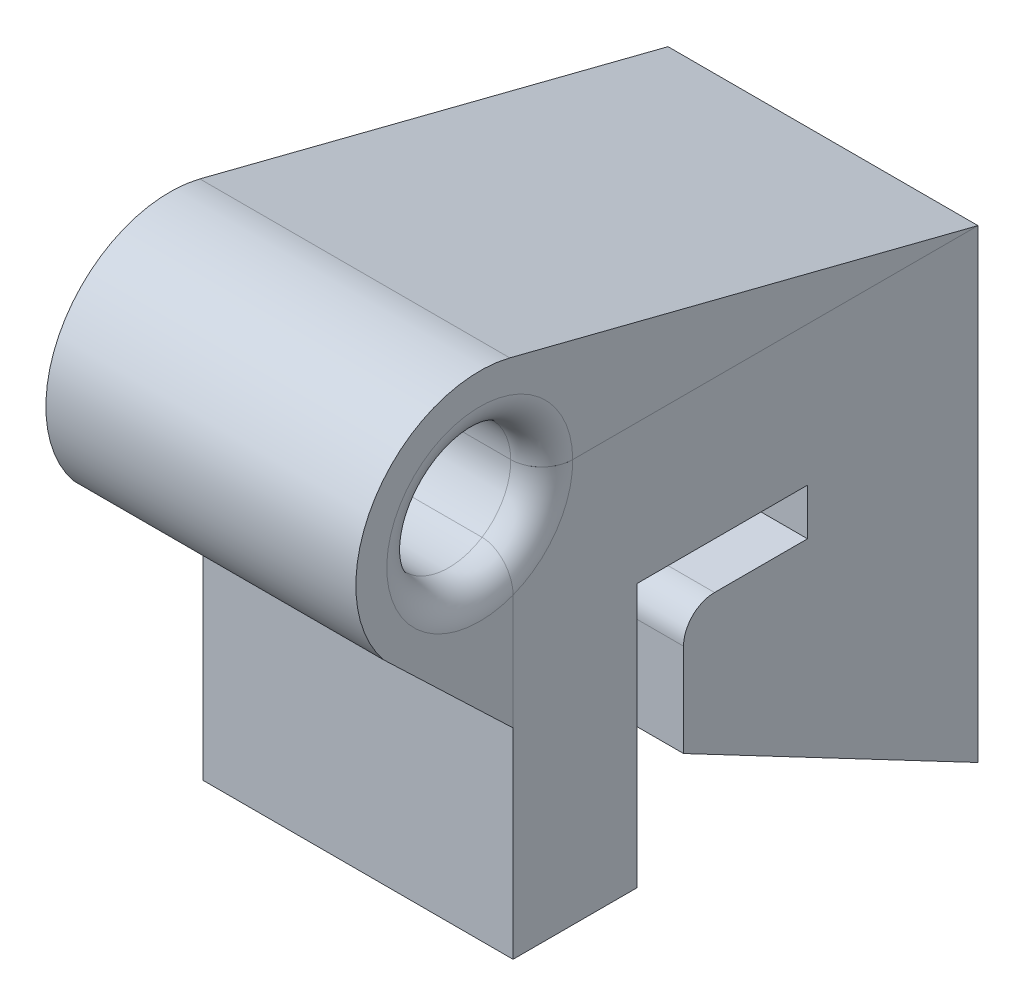
ISO-10303-21;
HEADER;
FILE_DESCRIPTION(('STEP AP214'),'2;1');
FILE_NAME('part.step','',(''),(''),'','','');
FILE_SCHEMA(('AUTOMOTIVE_DESIGN { 1 0 10303 214 1 1 1 1 }'));
ENDSEC;
DATA;
#1=APPLICATION_CONTEXT('core data for automotive mechanical design processes');
#2=APPLICATION_PROTOCOL_DEFINITION('international standard','automotive_design',2000,#1);
#3=PRODUCT_CONTEXT('',#1,'mechanical');
#4=PRODUCT('Part','Part','',(#3));
#5=PRODUCT_RELATED_PRODUCT_CATEGORY('part','',(#4));
#6=PRODUCT_DEFINITION_FORMATION('','',#4);
#7=PRODUCT_DEFINITION_CONTEXT('part definition',#1,'design');
#8=PRODUCT_DEFINITION('design','',#6,#7);
#9=PRODUCT_DEFINITION_SHAPE('','',#8);
#10=(LENGTH_UNIT() NAMED_UNIT(*) SI_UNIT(.MILLI.,.METRE.));
#11=(NAMED_UNIT(*) PLANE_ANGLE_UNIT() SI_UNIT($,.RADIAN.));
#12=(NAMED_UNIT(*) SI_UNIT($,.STERADIAN.) SOLID_ANGLE_UNIT());
#13=UNCERTAINTY_MEASURE_WITH_UNIT(LENGTH_MEASURE(1.E-05),#10,'distance_accuracy_value','');
#14=(GEOMETRIC_REPRESENTATION_CONTEXT(3) GLOBAL_UNCERTAINTY_ASSIGNED_CONTEXT((#13)) GLOBAL_UNIT_ASSIGNED_CONTEXT((#10,
#11,#12)) REPRESENTATION_CONTEXT('',''));
#15=CARTESIAN_POINT('',(0.,0.,0.));
#16=DIRECTION('',(0.,0.,1.));
#17=DIRECTION('',(1.,0.,0.));
#18=AXIS2_PLACEMENT_3D('',#15,#16,#17);
#19=CARTESIAN_POINT('',(10.,9.9788927812813,16.0740086389494));
#20=DIRECTION('',(-1.,0.,0.));
#21=DIRECTION('',(0.,0.,1.));
#22=AXIS2_PLACEMENT_3D('',#19,#20,#21);
#23=CYLINDRICAL_SURFACE('',#22,3.99767477306741);
#24=CARTESIAN_POINT('',(0.,9.9788927812813,16.0740086389494));
#25=DIRECTION('',(-1.,0.,0.));
#26=DIRECTION('',(0.,0.,1.));
#27=AXIS2_PLACEMENT_3D('',#24,#25,#26);
#28=CIRCLE('',#27,3.99767477306741);
#29=CARTESIAN_POINT('',(0.,7.44947043378368,19.1697195717077));
#30=VERTEX_POINT('',#29);
#31=CARTESIAN_POINT('',(0.,13.8572069803928,15.1044300891715));
#32=VERTEX_POINT('',#31);
#33=EDGE_CURVE('E146',#30,#32,#28,.T.);
#34=ORIENTED_EDGE('',*,*,#33,.F.);
#35=DIRECTION('',(-1.,0.,0.));
#36=VECTOR('',#35,1.);
#37=CARTESIAN_POINT('',(10.,7.44947043378368,19.1697195717077));
#38=LINE('',#37,#36);
#39=CARTESIAN_POINT('',(10.,7.44947043378368,19.1697195717077));
#40=VERTEX_POINT('',#39);
#41=EDGE_CURVE('E132',#40,#30,#38,.T.);
#42=ORIENTED_EDGE('',*,*,#41,.F.);
#43=CARTESIAN_POINT('',(10.,9.9788927812813,16.0740086389494));
#44=DIRECTION('',(-1.,0.,0.));
#45=DIRECTION('',(0.,0.,1.));
#46=AXIS2_PLACEMENT_3D('',#43,#44,#45);
#47=CIRCLE('',#46,3.99767477306741);
#48=CARTESIAN_POINT('',(10.,13.8572069803928,15.1044300891715));
#49=VERTEX_POINT('',#48);
#50=EDGE_CURVE('E128',#40,#49,#47,.T.);
#51=ORIENTED_EDGE('',*,*,#50,.T.);
#52=DIRECTION('',(-1.,0.,0.));
#53=VECTOR('',#52,1.);
#54=CARTESIAN_POINT('',(10.,13.8572069803928,15.1044300891715));
#55=LINE('',#54,#53);
#56=EDGE_CURVE('E112',#49,#32,#55,.T.);
#57=ORIENTED_EDGE('',*,*,#56,.T.);
#58=EDGE_LOOP('',(#34,#42,#51,#57));
#59=FACE_BOUND('',#58,.T.);
#60=ADVANCED_FACE('F43',(#59),#23,.T.);
#61=CARTESIAN_POINT('',(10.,7.44947043378368,19.1697195717077));
#62=DIRECTION('',(0.,-0.723120811339232,0.690721573579464));
#63=DIRECTION('',(0.,-0.690721573579464,-0.723120811339232));
#64=AXIS2_PLACEMENT_3D('',#61,#62,#63);
#65=PLANE('',#64);
#66=DIRECTION('',(0.,0.690721573579464,0.723120811339232));
#67=VECTOR('',#66,1.);
#68=CARTESIAN_POINT('',(0.,7.44947043378368,19.1697195717077));
#69=LINE('',#68,#67);
#70=CARTESIAN_POINT('',(0.,3.4665740507837,15.));
#71=VERTEX_POINT('',#70);
#72=EDGE_CURVE('E133',#71,#30,#69,.T.);
#73=ORIENTED_EDGE('',*,*,#72,.F.);
#74=DIRECTION('',(-1.,0.,0.));
#75=VECTOR('',#74,1.);
#76=CARTESIAN_POINT('',(10.,3.4665740507837,15.));
#77=LINE('',#76,#75);
#78=CARTESIAN_POINT('',(10.,3.4665740507837,15.));
#79=VERTEX_POINT('',#78);
#80=EDGE_CURVE('E155',#79,#71,#77,.T.);
#81=ORIENTED_EDGE('',*,*,#80,.F.);
#82=DIRECTION('',(0.,0.690721573579464,0.723120811339232));
#83=VECTOR('',#82,1.);
#84=CARTESIAN_POINT('',(10.,7.44947043378368,19.1697195717077));
#85=LINE('',#84,#83);
#86=EDGE_CURVE('E123',#79,#40,#85,.T.);
#87=ORIENTED_EDGE('',*,*,#86,.T.);
#88=ORIENTED_EDGE('',*,*,#41,.T.);
#89=EDGE_LOOP('',(#73,#81,#87,#88));
#90=FACE_BOUND('',#89,.T.);
#91=ADVANCED_FACE('F200',(#90),#65,.T.);
#92=CARTESIAN_POINT('',(10.,3.4665740507837,15.));
#93=DIRECTION('',(0.,0.,-1.));
#94=DIRECTION('',(-1.,0.,0.));
#95=AXIS2_PLACEMENT_3D('',#92,#93,#94);
#96=PLANE('',#95);
#97=DIRECTION('',(1.,0.,0.));
#98=VECTOR('',#97,1.);
#99=CARTESIAN_POINT('',(0.,8.29173379545276,15.));
#100=LINE('',#99,#98);
#101=CARTESIAN_POINT('',(9.,8.29173379545276,15.));
#102=VERTEX_POINT('',#101);
#103=CARTESIAN_POINT('',(1.,8.29173379545276,15.));
#104=VERTEX_POINT('',#103);
#105=EDGE_CURVE('E139',#102,#104,#100,.F.);
#106=ORIENTED_EDGE('',*,*,#105,.F.);
#107=CARTESIAN_POINT('',(9.,8.29173379545276,15.));
#108=CARTESIAN_POINT('',(9.02544709543695,8.2917373397642,15.));
#109=CARTESIAN_POINT('',(9.05087993396794,8.29058144530707,15.));
#110=CARTESIAN_POINT('',(9.10152589022747,8.28599452617313,15.));
#111=CARTESIAN_POINT('',(9.12673912119642,8.28256475420531,15.));
#112=CARTESIAN_POINT('',(9.20147613416767,8.26898797596519,15.));
#113=CARTESIAN_POINT('',(9.25043615503918,8.25555222936728,15.));
#114=CARTESIAN_POINT('',(9.34529535722023,8.22077683593449,15.));
#115=CARTESIAN_POINT('',(9.39120001043956,8.19945179356844,15.));
#116=CARTESIAN_POINT('',(9.47920726230042,8.14994855881443,15.));
#117=CARTESIAN_POINT('',(9.5213043619609,8.12176066499623,15.));
#118=CARTESIAN_POINT('',(9.60413836786882,8.05715681427401,15.));
#119=CARTESIAN_POINT('',(9.64450353596077,8.02026603030665,15.));
#120=CARTESIAN_POINT('',(9.71939960005461,7.94098928560996,15.));
#121=CARTESIAN_POINT('',(9.75392864524865,7.89860158914974,15.));
#122=CARTESIAN_POINT('',(9.82106092169255,7.8031840859586,15.));
#123=CARTESIAN_POINT('',(9.85272836561246,7.74949409430199,15.));
#124=CARTESIAN_POINT('',(9.90727784774768,7.63782435435628,15.));
#125=CARTESIAN_POINT('',(9.9301586578155,7.57984400773475,15.));
#126=CARTESIAN_POINT('',(9.96535337089247,7.46499711165469,15.));
#127=CARTESIAN_POINT('',(9.97827163769251,7.40831540789738,15.));
#128=CARTESIAN_POINT('',(9.99560330111521,7.29367824872859,15.));
#129=CARTESIAN_POINT('',(10.000017797882,7.23572295906396,15.));
#130=CARTESIAN_POINT('',(10.,7.17773133583372,15.));
#131=B_SPLINE_CURVE_WITH_KNOTS('',3,(#107,#108,#109,#110,#111,#112,#113,#114,#115,#116,#117,
#118,#119,#120,#121,#122,#123,#124,#125,#126,#127,#128,#129,#130),.UNSPECIFIED.,.F.,.F.,(4,2,2,
2,2,2,2,2,2,2,2,4),(0.,0.0762877730423833,0.152533553033116,0.304022916827351,0.455233239164212,
0.606658568597842,0.770075857739805,0.933544874512594,1.11974974761394,1.30598063794629,
1.47975656984723,1.65351001861339),.UNSPECIFIED.);
#132=CARTESIAN_POINT('',(10.,7.17773133583372,15.));
#133=VERTEX_POINT('',#132);
#134=EDGE_CURVE('E70',#102,#133,#131,.T.);
#135=ORIENTED_EDGE('',*,*,#134,.T.);
#136=DIRECTION('',(0.,-1.,0.));
#137=VECTOR('',#136,1.);
#138=CARTESIAN_POINT('',(10.,3.4665740507837,15.));
#139=LINE('',#138,#137);
#140=EDGE_CURVE('E143',#133,#79,#139,.T.);
#141=ORIENTED_EDGE('',*,*,#140,.T.);
#142=ORIENTED_EDGE('',*,*,#80,.T.);
#143=DIRECTION('',(0.,-1.,0.));
#144=VECTOR('',#143,1.);
#145=CARTESIAN_POINT('',(0.,3.4665740507837,15.));
#146=LINE('',#145,#144);
#147=CARTESIAN_POINT('',(0.,7.17773133583372,15.));
#148=VERTEX_POINT('',#147);
#149=EDGE_CURVE('E136',#148,#71,#146,.T.);
#150=ORIENTED_EDGE('',*,*,#149,.F.);
#151=CARTESIAN_POINT('',(0.,7.17773133583372,15.));
#152=CARTESIAN_POINT('',(-3.0125685499296E-05,7.24388369611441,15.));
#153=CARTESIAN_POINT('',(0.00572053511767974,7.309984499745,15.));
#154=CARTESIAN_POINT('',(0.028207000909354,7.44023876160246,15.));
#155=CARTESIAN_POINT('',(0.044933292872155,7.50439385592061,15.));
#156=CARTESIAN_POINT('',(0.0887890039281296,7.62901184815055,15.));
#157=CARTESIAN_POINT('',(0.115914861022887,7.68947600205074,15.));
#158=CARTESIAN_POINT('',(0.179898225159355,7.8050801472146,15.));
#159=CARTESIAN_POINT('',(0.216761707756766,7.86021684077567,15.));
#160=CARTESIAN_POINT('',(0.29958713220885,7.96349425058462,15.));
#161=CARTESIAN_POINT('',(0.345577501387863,8.01161227227202,15.));
#162=CARTESIAN_POINT('',(0.445653493299341,8.09854120549787,15.));
#163=CARTESIAN_POINT('',(0.499728947451445,8.13736365073428,15.));
#164=CARTESIAN_POINT('',(0.601276270595055,8.19570482164855,15.));
#165=CARTESIAN_POINT('',(0.647383281943714,8.21761145380768,15.));
#166=CARTESIAN_POINT('',(0.742567546893551,8.25339992290209,15.));
#167=CARTESIAN_POINT('',(0.791637835410688,8.26729982597099,15.));
#168=CARTESIAN_POINT('',(0.867616436116075,8.28172691957979,15.));
#169=CARTESIAN_POINT('',(0.893946461663748,8.28547018751634,15.));
#170=CARTESIAN_POINT('',(0.946845688375509,8.29047609741769,15.));
#171=CARTESIAN_POINT('',(0.973414932851386,8.29173828071237,15.));
#172=CARTESIAN_POINT('',(1.,8.29173379545276,15.));
#173=B_SPLINE_CURVE_WITH_KNOTS('',3,(#151,#152,#153,#154,#155,#156,#157,#158,#159,#160,#161,
#162,#163,#164,#165,#166,#167,#168,#169,#170,#171,#172),.UNSPECIFIED.,.F.,.F.,(4,2,2,2,2,2,2,2,
2,2,4),(0.,0.198136438131944,0.396101369793226,0.593998556150797,0.792017466636026,
0.990663106316008,1.18906097962663,1.34157754140846,1.4937486077942,1.57342903743854,
1.65312419596224),.UNSPECIFIED.);
#174=EDGE_CURVE('E161',#148,#104,#173,.T.);
#175=ORIENTED_EDGE('',*,*,#174,.T.);
#176=EDGE_LOOP('',(#106,#135,#141,#142,#150,#175));
#177=FACE_BOUND('',#176,.T.);
#178=ADVANCED_FACE('F170',(#177),#96,.T.);
#179=CARTESIAN_POINT('',(10.,10.,15.));
#180=DIRECTION('',(0.,-1.,0.));
#181=DIRECTION('',(0.,0.,-1.));
#182=AXIS2_PLACEMENT_3D('',#179,#180,#181);
#183=PLANE('',#182);
#184=DIRECTION('',(0.,0.,1.));
#185=VECTOR('',#184,1.);
#186=CARTESIAN_POINT('',(10.,10.,15.));
#187=LINE('',#186,#185);
#188=CARTESIAN_POINT('',(10.,10.,0.));
#189=VERTEX_POINT('',#188);
#190=CARTESIAN_POINT('',(10.,10.,13.0740828923154));
#191=VERTEX_POINT('',#190);
#192=EDGE_CURVE('E130',#189,#191,#187,.T.);
#193=ORIENTED_EDGE('',*,*,#192,.T.);
#194=CARTESIAN_POINT('',(10.,10.,13.0740828923154));
#195=CARTESIAN_POINT('',(9.99999981267615,10.,13.1022192326804));
#196=CARTESIAN_POINT('',(9.99881183343086,10.,13.1303420928692));
#197=CARTESIAN_POINT('',(9.99407250941234,10.,13.1863865676825));
#198=CARTESIAN_POINT('',(9.99052127810508,10.,13.2143081919037));
#199=CARTESIAN_POINT('',(9.97635644858273,10.,13.2974224014069));
#200=CARTESIAN_POINT('',(9.96223162115841,10.,13.3520582496375));
#201=CARTESIAN_POINT('',(9.92501038505813,10.,13.458181552626));
#202=CARTESIAN_POINT('',(9.90190967137826,10.,13.5096674828882));
#203=CARTESIAN_POINT('',(9.84739478290441,10.,13.608028819944));
#204=CARTESIAN_POINT('',(9.81598207224556,10.,13.654905036733));
#205=CARTESIAN_POINT('',(9.74573438266287,10.,13.7427163565741));
#206=CARTESIAN_POINT('',(9.70689948168677,10.,13.7836515220111));
#207=CARTESIAN_POINT('',(9.62289906415489,10.,13.8584295646163));
#208=CARTESIAN_POINT('',(9.57773231111771,10.,13.8922710533058));
#209=CARTESIAN_POINT('',(9.48235500208137,10.,13.9518939594177));
#210=CARTESIAN_POINT('',(9.43214359819379,10.,13.9776740188968));
#211=CARTESIAN_POINT('',(9.32811508390314,10.,14.0204246454582));
#212=CARTESIAN_POINT('',(9.2743001093107,10.,14.037400379524));
#213=CARTESIAN_POINT('',(9.18346297902891,10.,14.0578400170123));
#214=CARTESIAN_POINT('',(9.14701243526492,10.,14.0639413253263));
#215=CARTESIAN_POINT('',(9.07371302402608,10.,14.0720807898538));
#216=CARTESIAN_POINT('',(9.03686479579395,10.,14.0741247044418));
#217=CARTESIAN_POINT('',(9.,10.,14.0741200207214));
#218=B_SPLINE_CURVE_WITH_KNOTS('',3,(#194,#195,#196,#197,#198,#199,#200,#201,#202,#203,#204,
#205,#206,#207,#208,#209,#210,#211,#212,#213,#214,#215,#216,#217),.UNSPECIFIED.,.F.,.F.,(4,2,2,
2,2,2,2,2,2,2,2,4),(0.,0.0843571735106671,0.168710297103282,0.337138352430977,0.505647288935414,
0.674126562796607,0.842604067387757,1.01111451814368,1.17965333911844,1.34809313768172,
1.45875581829624,1.56926133052303),.UNSPECIFIED.);
#219=CARTESIAN_POINT('',(9.,10.,14.0741200207214));
#220=VERTEX_POINT('',#219);
#221=EDGE_CURVE('E12',#191,#220,#218,.T.);
#222=ORIENTED_EDGE('',*,*,#221,.T.);
#223=DIRECTION('',(1.,0.,0.));
#224=VECTOR('',#223,1.);
#225=CARTESIAN_POINT('',(0.,10.,14.0741200207214));
#226=LINE('',#225,#224);
#227=CARTESIAN_POINT('',(1.,10.,14.0741200207214));
#228=VERTEX_POINT('',#227);
#229=EDGE_CURVE('E220',#228,#220,#226,.T.);
#230=ORIENTED_EDGE('',*,*,#229,.F.);
#231=CARTESIAN_POINT('',(1.,10.,14.0741200207214));
#232=CARTESIAN_POINT('',(0.971866234881468,10.,14.0741198348651));
#233=CARTESIAN_POINT('',(0.943745948604871,10.,14.0729319465127));
#234=CARTESIAN_POINT('',(0.887706612508961,10.,14.0681929847874));
#235=CARTESIAN_POINT('',(0.859787553070328,10.,14.0646420251449));
#236=CARTESIAN_POINT('',(0.776681112263235,10.,14.0504783023569));
#237=CARTESIAN_POINT('',(0.722050432171713,10.,14.0363546016038));
#238=CARTESIAN_POINT('',(0.615937232287861,10.,13.9991365152918));
#239=CARTESIAN_POINT('',(0.564456235013657,10.,13.9760378303766));
#240=CARTESIAN_POINT('',(0.466104167363311,10.,13.9215280541669));
#241=CARTESIAN_POINT('',(0.419232289702957,10.,13.8901184220988));
#242=CARTESIAN_POINT('',(0.33142725948012,10.,13.8198769560327));
#243=CARTESIAN_POINT('',(0.290494230159394,10.,13.7810449680461));
#244=CARTESIAN_POINT('',(0.215719369888499,10.,13.6970511448349));
#245=CARTESIAN_POINT('',(0.18187892846932,10.,13.6518880721546));
#246=CARTESIAN_POINT('',(0.122254370587293,10.,13.5565152902386));
#247=CARTESIAN_POINT('',(0.0964721948418925,10.,13.5063043691433));
#248=CARTESIAN_POINT('',(0.0537166101945912,10.,13.402276647408));
#249=CARTESIAN_POINT('',(0.0367380437921304,10.,13.3484619788995));
#250=CARTESIAN_POINT('',(0.0162901221563924,10.,13.25761228751));
#251=CARTESIAN_POINT('',(0.010185026658284,10.,13.2211486888876));
#252=CARTESIAN_POINT('',(0.00204050162099302,10.,13.1478227866445));
#253=CARTESIAN_POINT('',(-4.68939928737875E-06,10.,13.1109611227779));
#254=CARTESIAN_POINT('',(0.,10.,13.0740828923154));
#255=B_SPLINE_CURVE_WITH_KNOTS('',3,(#231,#232,#233,#234,#235,#236,#237,#238,#239,#240,#241,
#242,#243,#244,#245,#246,#247,#248,#249,#250,#251,#252,#253,#254),.UNSPECIFIED.,.F.,.F.,(4,2,2,
2,2,2,2,2,2,2,2,4),(0.,0.0843494518869789,0.168694844481585,0.337107111766347,0.505600154547458,
0.674063633123044,0.842530607118182,1.01103055521524,1.17957105288877,1.34801270103404,
1.45871568355569,1.5692614529184),.UNSPECIFIED.);
#256=CARTESIAN_POINT('',(0.,10.,13.0740828923154));
#257=VERTEX_POINT('',#256);
#258=EDGE_CURVE('E181',#228,#257,#255,.T.);
#259=ORIENTED_EDGE('',*,*,#258,.T.);
#260=DIRECTION('',(0.,0.,1.));
#261=VECTOR('',#260,1.);
#262=CARTESIAN_POINT('',(0.,10.,15.));
#263=LINE('',#262,#261);
#264=CARTESIAN_POINT('',(0.,10.,0.));
#265=VERTEX_POINT('',#264);
#266=EDGE_CURVE('E149',#265,#257,#263,.T.);
#267=ORIENTED_EDGE('',*,*,#266,.F.);
#268=DIRECTION('',(-1.,0.,0.));
#269=VECTOR('',#268,1.);
#270=CARTESIAN_POINT('',(10.,10.,0.));
#271=LINE('',#270,#269);
#272=EDGE_CURVE('E122',#189,#265,#271,.T.);
#273=ORIENTED_EDGE('',*,*,#272,.F.);
#274=EDGE_LOOP('',(#193,#222,#230,#259,#267,#273));
#275=FACE_BOUND('',#274,.T.);
#276=ADVANCED_FACE('F188',(#275),#183,.T.);
#277=CARTESIAN_POINT('',(10.,10.,0.));
#278=DIRECTION('',(0.,0.968906074081107,-0.247428817256067));
#279=DIRECTION('',(0.,0.247428817256067,0.968906074081107));
#280=AXIS2_PLACEMENT_3D('',#277,#278,#279);
#281=PLANE('',#280);
#282=DIRECTION('',(0.,-0.247428817256067,-0.968906074081107));
#283=VECTOR('',#282,1.);
#284=CARTESIAN_POINT('',(0.,10.,0.));
#285=LINE('',#284,#283);
#286=EDGE_CURVE('E117',#32,#265,#285,.T.);
#287=ORIENTED_EDGE('',*,*,#286,.F.);
#288=ORIENTED_EDGE('',*,*,#56,.F.);
#289=DIRECTION('',(0.,-0.247428817256067,-0.968906074081107));
#290=VECTOR('',#289,1.);
#291=CARTESIAN_POINT('',(10.,10.,0.));
#292=LINE('',#291,#290);
#293=EDGE_CURVE('E115',#49,#189,#292,.T.);
#294=ORIENTED_EDGE('',*,*,#293,.T.);
#295=ORIENTED_EDGE('',*,*,#272,.T.);
#296=EDGE_LOOP('',(#287,#288,#294,#295));
#297=FACE_BOUND('',#296,.T.);
#298=ADVANCED_FACE('F114',(#297),#281,.T.);
#299=CARTESIAN_POINT('',(10.,9.9788927812813,16.0740086389494));
#300=DIRECTION('',(-1.,0.,0.));
#301=DIRECTION('',(0.,0.,1.));
#302=AXIS2_PLACEMENT_3D('',#299,#300,#301);
#303=PLANE('',#302);
#304=ORIENTED_EDGE('',*,*,#140,.F.);
#305=CARTESIAN_POINT('',(10.,9.9788927812813,16.0740086389494));
#306=DIRECTION('',(-1.,0.,0.));
#307=DIRECTION('',(0.,0.,1.));
#308=AXIS2_PLACEMENT_3D('',#305,#306,#307);
#309=CIRCLE('',#308,3.);
#310=EDGE_CURVE('E56',#133,#191,#309,.T.);
#311=ORIENTED_EDGE('',*,*,#310,.T.);
#312=ORIENTED_EDGE('',*,*,#192,.F.);
#313=ORIENTED_EDGE('',*,*,#293,.F.);
#314=ORIENTED_EDGE('',*,*,#50,.F.);
#315=ORIENTED_EDGE('',*,*,#86,.F.);
#316=EDGE_LOOP('',(#304,#311,#312,#313,#314,#315));
#317=FACE_BOUND('',#316,.T.);
#318=ADVANCED_FACE('F126',(#317),#303,.F.);
#319=CARTESIAN_POINT('',(0.,9.9788927812813,16.0740086389494));
#320=DIRECTION('',(-1.,0.,0.));
#321=DIRECTION('',(0.,0.,1.));
#322=AXIS2_PLACEMENT_3D('',#319,#320,#321);
#323=PLANE('',#322);
#324=ORIENTED_EDGE('',*,*,#266,.T.);
#325=CARTESIAN_POINT('',(0.,9.9788927812813,16.0740086389494));
#326=DIRECTION('',(-1.,0.,0.));
#327=DIRECTION('',(0.,0.,1.));
#328=AXIS2_PLACEMENT_3D('',#325,#326,#327);
#329=CIRCLE('',#328,3.);
#330=EDGE_CURVE('E154',#257,#148,#329,.F.);
#331=ORIENTED_EDGE('',*,*,#330,.T.);
#332=ORIENTED_EDGE('',*,*,#149,.T.);
#333=ORIENTED_EDGE('',*,*,#72,.T.);
#334=ORIENTED_EDGE('',*,*,#33,.T.);
#335=ORIENTED_EDGE('',*,*,#286,.T.);
#336=EDGE_LOOP('',(#324,#331,#332,#333,#334,#335));
#337=FACE_BOUND('',#336,.T.);
#338=ADVANCED_FACE('F197',(#337),#323,.T.);
#339=CARTESIAN_POINT('',(0.,9.9788927812813,16.0740086389494));
#340=DIRECTION('',(1.,0.,0.));
#341=DIRECTION('',(0.,0.,-1.));
#342=AXIS2_PLACEMENT_3D('',#339,#340,#341);
#343=CYLINDRICAL_SURFACE('',#342,2.);
#344=ORIENTED_EDGE('',*,*,#229,.T.);
#345=CARTESIAN_POINT('',(9.,9.9788927812813,16.0740086389494));
#346=DIRECTION('',(-1.,0.,0.));
#347=DIRECTION('',(0.,0.,1.));
#348=AXIS2_PLACEMENT_3D('',#345,#346,#347);
#349=CIRCLE('',#348,2.);
#350=EDGE_CURVE('E186',#220,#102,#349,.F.);
#351=ORIENTED_EDGE('',*,*,#350,.T.);
#352=ORIENTED_EDGE('',*,*,#105,.T.);
#353=CARTESIAN_POINT('',(1.,9.9788927812813,16.0740086389494));
#354=DIRECTION('',(-1.,0.,0.));
#355=DIRECTION('',(0.,0.,1.));
#356=AXIS2_PLACEMENT_3D('',#353,#354,#355);
#357=CIRCLE('',#356,2.);
#358=EDGE_CURVE('E168',#104,#228,#357,.T.);
#359=ORIENTED_EDGE('',*,*,#358,.T.);
#360=EDGE_LOOP('',(#344,#351,#352,#359));
#361=FACE_BOUND('',#360,.T.);
#362=ADVANCED_FACE('F177',(#361),#343,.F.);
#363=CARTESIAN_POINT('',(1.,9.9788927812813,16.0740086389494));
#364=DIRECTION('',(-1.,0.,0.));
#365=DIRECTION('',(0.,0.,1.));
#366=AXIS2_PLACEMENT_3D('',#363,#364,#365);
#367=TOROIDAL_SURFACE('',#366,3.,1.);
#368=ORIENTED_EDGE('',*,*,#258,.F.);
#369=ORIENTED_EDGE('',*,*,#358,.F.);
#370=ORIENTED_EDGE('',*,*,#174,.F.);
#371=ORIENTED_EDGE('',*,*,#330,.F.);
#372=EDGE_LOOP('',(#368,#369,#370,#371));
#373=FACE_BOUND('',#372,.T.);
#374=ADVANCED_FACE('F173',(#373),#367,.T.);
#375=CARTESIAN_POINT('',(9.,9.9788927812813,16.0740086389494));
#376=DIRECTION('',(-1.,0.,0.));
#377=DIRECTION('',(0.,0.,1.));
#378=AXIS2_PLACEMENT_3D('',#375,#376,#377);
#379=TOROIDAL_SURFACE('',#378,3.,1.);
#380=ORIENTED_EDGE('',*,*,#221,.F.);
#381=ORIENTED_EDGE('',*,*,#310,.F.);
#382=ORIENTED_EDGE('',*,*,#134,.F.);
#383=ORIENTED_EDGE('',*,*,#350,.F.);
#384=EDGE_LOOP('',(#380,#381,#382,#383));
#385=FACE_BOUND('',#384,.T.);
#386=ADVANCED_FACE('F45',(#385),#379,.T.);
#387=CLOSED_SHELL('',(#60,#91,#178,#276,#298,#318,#338,#362,#374,#386));
#388=MANIFOLD_SOLID_BREP('B2',#387);
#389=CARTESIAN_POINT('',(10.,0.,9.5));
#390=DIRECTION('',(0.,0.884918222381982,-0.465746432832623));
#391=DIRECTION('',(0.,0.465746432832623,0.884918222381982));
#392=AXIS2_PLACEMENT_3D('',#389,#390,#391);
#393=PLANE('',#392);
#394=DIRECTION('',(0.,-0.465746432832623,-0.884918222381982));
#395=VECTOR('',#394,1.);
#396=CARTESIAN_POINT('',(0.,0.,9.5));
#397=LINE('',#396,#395);
#398=CARTESIAN_POINT('',(0.,0.,9.5));
#399=VERTEX_POINT('',#398);
#400=CARTESIAN_POINT('',(0.,-5.,0.));
#401=VERTEX_POINT('',#400);
#402=EDGE_CURVE('E420',#399,#401,#397,.T.);
#403=ORIENTED_EDGE('',*,*,#402,.T.);
#404=DIRECTION('',(-1.,0.,0.));
#405=VECTOR('',#404,1.);
#406=CARTESIAN_POINT('',(10.,-5.,0.));
#407=LINE('',#406,#405);
#408=CARTESIAN_POINT('',(10.,-5.,0.));
#409=VERTEX_POINT('',#408);
#410=EDGE_CURVE('E400',#409,#401,#407,.T.);
#411=ORIENTED_EDGE('',*,*,#410,.F.);
#412=DIRECTION('',(0.,-0.465746432832623,-0.884918222381982));
#413=VECTOR('',#412,1.);
#414=CARTESIAN_POINT('',(10.,0.,9.5));
#415=LINE('',#414,#413);
#416=CARTESIAN_POINT('',(10.,0.,9.5));
#417=VERTEX_POINT('',#416);
#418=EDGE_CURVE('E408',#417,#409,#415,.T.);
#419=ORIENTED_EDGE('',*,*,#418,.F.);
#420=DIRECTION('',(-1.,0.,0.));
#421=VECTOR('',#420,1.);
#422=CARTESIAN_POINT('',(10.,0.,9.5));
#423=LINE('',#422,#421);
#424=EDGE_CURVE('E501',#417,#399,#423,.T.);
#425=ORIENTED_EDGE('',*,*,#424,.T.);
#426=EDGE_LOOP('',(#403,#411,#419,#425));
#427=FACE_BOUND('',#426,.T.);
#428=ADVANCED_FACE('F291',(#427),#393,.F.);
#429=CARTESIAN_POINT('',(10.,-5.,0.));
#430=DIRECTION('',(0.,0.,1.));
#431=DIRECTION('',(1.,0.,0.));
#432=AXIS2_PLACEMENT_3D('',#429,#430,#431);
#433=PLANE('',#432);
#434=DIRECTION('',(0.,1.,0.));
#435=VECTOR('',#434,1.);
#436=CARTESIAN_POINT('',(0.,-5.,0.));
#437=LINE('',#436,#435);
#438=CARTESIAN_POINT('',(0.,10.,0.));
#439=VERTEX_POINT('',#438);
#440=EDGE_CURVE('E503',#401,#439,#437,.T.);
#441=ORIENTED_EDGE('',*,*,#440,.T.);
#442=DIRECTION('',(-1.,0.,0.));
#443=VECTOR('',#442,1.);
#444=CARTESIAN_POINT('',(10.,10.,0.));
#445=LINE('',#444,#443);
#446=CARTESIAN_POINT('',(10.,10.,0.));
#447=VERTEX_POINT('',#446);
#448=EDGE_CURVE('E403',#447,#439,#445,.T.);
#449=ORIENTED_EDGE('',*,*,#448,.F.);
#450=DIRECTION('',(0.,1.,0.));
#451=VECTOR('',#450,1.);
#452=CARTESIAN_POINT('',(10.,-5.,0.));
#453=LINE('',#452,#451);
#454=EDGE_CURVE('E396',#409,#447,#453,.T.);
#455=ORIENTED_EDGE('',*,*,#454,.F.);
#456=ORIENTED_EDGE('',*,*,#410,.T.);
#457=EDGE_LOOP('',(#441,#449,#455,#456));
#458=FACE_BOUND('',#457,.T.);
#459=ADVANCED_FACE('F398',(#458),#433,.F.);
#460=CARTESIAN_POINT('',(10.,10.,0.));
#461=DIRECTION('',(0.,-1.,0.));
#462=DIRECTION('',(0.,0.,-1.));
#463=AXIS2_PLACEMENT_3D('',#460,#461,#462);
#464=PLANE('',#463);
#465=DIRECTION('',(0.,0.,1.));
#466=VECTOR('',#465,1.);
#467=CARTESIAN_POINT('',(0.,10.,0.));
#468=LINE('',#467,#466);
#469=CARTESIAN_POINT('',(0.,10.,13.0740828923154));
#470=VERTEX_POINT('',#469);
#471=EDGE_CURVE('E505',#439,#470,#468,.T.);
#472=ORIENTED_EDGE('',*,*,#471,.T.);
#473=CARTESIAN_POINT('',(0.,10.,13.0740828923154));
#474=CARTESIAN_POINT('',(1.87323847711106E-07,10.,13.1022192326804));
#475=CARTESIAN_POINT('',(0.001188166569145,10.,13.1303420928692));
#476=CARTESIAN_POINT('',(0.00592749058766025,10.,13.1863865676825));
#477=CARTESIAN_POINT('',(0.00947872189491804,10.,13.2143081919037));
#478=CARTESIAN_POINT('',(0.0236435514172672,10.,13.2974224014069));
#479=CARTESIAN_POINT('',(0.0377683788415905,10.,13.3520582496375));
#480=CARTESIAN_POINT('',(0.074989614941868,10.,13.458181552626));
#481=CARTESIAN_POINT('',(0.0980903286217454,10.,13.5096674828882));
#482=CARTESIAN_POINT('',(0.152605217095589,10.,13.608028819944));
#483=CARTESIAN_POINT('',(0.184017927754435,10.,13.654905036733));
#484=CARTESIAN_POINT('',(0.254265617337133,10.,13.7427163565741));
#485=CARTESIAN_POINT('',(0.293100518313234,10.,13.7836515220111));
#486=CARTESIAN_POINT('',(0.377100935845109,10.,13.8584295646163));
#487=CARTESIAN_POINT('',(0.422267688882294,10.,13.8922710533058));
#488=CARTESIAN_POINT('',(0.517644997918633,10.,13.9518939594177));
#489=CARTESIAN_POINT('',(0.56785640180621,10.,13.9776740188968));
#490=CARTESIAN_POINT('',(0.671884916096867,10.,14.0204246454582));
#491=CARTESIAN_POINT('',(0.725699890689296,10.,14.037400379524));
#492=CARTESIAN_POINT('',(0.816537020971095,10.,14.0578400170123));
#493=CARTESIAN_POINT('',(0.85298756473508,10.,14.0639413253263));
#494=CARTESIAN_POINT('',(0.926286975973919,10.,14.0720807898538));
#495=CARTESIAN_POINT('',(0.963135204206053,10.,14.0741247044418));
#496=CARTESIAN_POINT('',(1.,10.,14.0741200207214));
#497=B_SPLINE_CURVE_WITH_KNOTS('',3,(#473,#474,#475,#476,#477,#478,#479,#480,#481,#482,#483,
#484,#485,#486,#487,#488,#489,#490,#491,#492,#493,#494,#495,#496),.UNSPECIFIED.,.F.,.F.,(4,2,2,
2,2,2,2,2,2,2,2,4),(0.,0.0843571735106654,0.168710297103282,0.337138352430978,0.505647288935412,
0.674126562796606,0.84260406738776,1.01111451814369,1.17965333911844,1.34809313768172,
1.45875581829624,1.56926133052303),.UNSPECIFIED.);
#498=CARTESIAN_POINT('',(1.,10.,14.0741200207214));
#499=VERTEX_POINT('',#498);
#500=EDGE_CURVE('E318',#470,#499,#497,.T.);
#501=ORIENTED_EDGE('',*,*,#500,.T.);
#502=DIRECTION('',(1.,0.,0.));
#503=VECTOR('',#502,1.);
#504=CARTESIAN_POINT('',(0.,10.,14.0741200207214));
#505=LINE('',#504,#503);
#506=CARTESIAN_POINT('',(9.,10.,14.0741200207214));
#507=VERTEX_POINT('',#506);
#508=EDGE_CURVE('E483',#499,#507,#505,.T.);
#509=ORIENTED_EDGE('',*,*,#508,.T.);
#510=CARTESIAN_POINT('',(9.,10.,14.0741200207214));
#511=CARTESIAN_POINT('',(9.02813376511853,10.,14.0741198348651));
#512=CARTESIAN_POINT('',(9.05625405139513,10.,14.0729319465127));
#513=CARTESIAN_POINT('',(9.11229338749104,10.,14.0681929847874));
#514=CARTESIAN_POINT('',(9.14021244692967,10.,14.0646420251449));
#515=CARTESIAN_POINT('',(9.22331888773676,10.,14.0504783023569));
#516=CARTESIAN_POINT('',(9.27794956782829,10.,14.0363546016038));
#517=CARTESIAN_POINT('',(9.38406276771214,10.,13.9991365152918));
#518=CARTESIAN_POINT('',(9.43554376498634,10.,13.9760378303766));
#519=CARTESIAN_POINT('',(9.53389583263669,10.,13.9215280541669));
#520=CARTESIAN_POINT('',(9.58076771029704,10.,13.8901184220988));
#521=CARTESIAN_POINT('',(9.66857274051988,10.,13.8198769560327));
#522=CARTESIAN_POINT('',(9.70950576984061,10.,13.7810449680461));
#523=CARTESIAN_POINT('',(9.7842806301115,10.,13.6970511448349));
#524=CARTESIAN_POINT('',(9.81812107153068,10.,13.6518880721546));
#525=CARTESIAN_POINT('',(9.87774562941271,10.,13.5565152902386));
#526=CARTESIAN_POINT('',(9.90352780515811,10.,13.5063043691433));
#527=CARTESIAN_POINT('',(9.94628338980541,10.,13.402276647408));
#528=CARTESIAN_POINT('',(9.96326195620787,10.,13.3484619788995));
#529=CARTESIAN_POINT('',(9.98370987784361,10.,13.25761228751));
#530=CARTESIAN_POINT('',(9.98981497334172,10.,13.2211486888876));
#531=CARTESIAN_POINT('',(9.99795949837901,10.,13.1478227866445));
#532=CARTESIAN_POINT('',(10.0000046893993,10.,13.1109611227779));
#533=CARTESIAN_POINT('',(10.,10.,13.0740828923154));
#534=B_SPLINE_CURVE_WITH_KNOTS('',3,(#510,#511,#512,#513,#514,#515,#516,#517,#518,#519,#520,
#521,#522,#523,#524,#525,#526,#527,#528,#529,#530,#531,#532,#533),.UNSPECIFIED.,.F.,.F.,(4,2,2,
2,2,2,2,2,2,2,2,4),(0.,0.0843494518869795,0.168694844481584,0.337107111766347,0.505600154547459,
0.674063633123042,0.842530607118179,1.01103055521524,1.17957105288877,1.34801270103404,
1.45871568355569,1.5692614529184),.UNSPECIFIED.);
#535=CARTESIAN_POINT('',(10.,10.,13.0740828923154));
#536=VERTEX_POINT('',#535);
#537=EDGE_CURVE('E438',#507,#536,#534,.T.);
#538=ORIENTED_EDGE('',*,*,#537,.T.);
#539=DIRECTION('',(0.,0.,1.));
#540=VECTOR('',#539,1.);
#541=CARTESIAN_POINT('',(10.,10.,0.));
#542=LINE('',#541,#540);
#543=EDGE_CURVE('E407',#447,#536,#542,.T.);
#544=ORIENTED_EDGE('',*,*,#543,.F.);
#545=ORIENTED_EDGE('',*,*,#448,.T.);
#546=EDGE_LOOP('',(#472,#501,#509,#538,#544,#545));
#547=FACE_BOUND('',#546,.T.);
#548=ADVANCED_FACE('F449',(#547),#464,.F.);
#549=CARTESIAN_POINT('',(10.,10.,15.));
#550=DIRECTION('',(0.,0.,-1.));
#551=DIRECTION('',(0.,1.,0.));
#552=AXIS2_PLACEMENT_3D('',#549,#550,#551);
#553=PLANE('',#552);
#554=DIRECTION('',(1.,0.,0.));
#555=VECTOR('',#554,1.);
#556=CARTESIAN_POINT('',(0.,8.29173379545276,15.));
#557=LINE('',#556,#555);
#558=CARTESIAN_POINT('',(9.,8.29173379545276,15.));
#559=VERTEX_POINT('',#558);
#560=CARTESIAN_POINT('',(1.,8.29173379545276,15.));
#561=VERTEX_POINT('',#560);
#562=EDGE_CURVE('E484',#559,#561,#557,.F.);
#563=ORIENTED_EDGE('',*,*,#562,.T.);
#564=CARTESIAN_POINT('',(1.,8.29173379545276,15.));
#565=CARTESIAN_POINT('',(0.974552904563051,8.2917373397642,15.));
#566=CARTESIAN_POINT('',(0.949120066032064,8.29058144530707,15.));
#567=CARTESIAN_POINT('',(0.898474109772535,8.28599452617313,15.));
#568=CARTESIAN_POINT('',(0.873260878803582,8.28256475420531,15.));
#569=CARTESIAN_POINT('',(0.798523865832333,8.26898797596519,15.));
#570=CARTESIAN_POINT('',(0.749563844960819,8.25555222936728,15.));
#571=CARTESIAN_POINT('',(0.654704642779769,8.22077683593449,15.));
#572=CARTESIAN_POINT('',(0.608799989560439,8.19945179356844,15.));
#573=CARTESIAN_POINT('',(0.520792737699584,8.14994855881443,15.));
#574=CARTESIAN_POINT('',(0.478695638039105,8.12176066499623,15.));
#575=CARTESIAN_POINT('',(0.395861632131182,8.05715681427401,15.));
#576=CARTESIAN_POINT('',(0.355496464039229,8.02026603030665,15.));
#577=CARTESIAN_POINT('',(0.280600399945389,7.94098928560996,15.));
#578=CARTESIAN_POINT('',(0.246071354751345,7.89860158914974,15.));
#579=CARTESIAN_POINT('',(0.178939078307454,7.80318408595859,15.));
#580=CARTESIAN_POINT('',(0.14727163438754,7.74949409430199,15.));
#581=CARTESIAN_POINT('',(0.0927221522523198,7.63782435435628,15.));
#582=CARTESIAN_POINT('',(0.0698413421845065,7.57984400773475,15.));
#583=CARTESIAN_POINT('',(0.0346466291075357,7.46499711165469,15.));
#584=CARTESIAN_POINT('',(0.0217283623074906,7.40831540789738,15.));
#585=CARTESIAN_POINT('',(0.00439669888478973,7.29367824872859,15.));
#586=CARTESIAN_POINT('',(-1.77978819588488E-05,7.23572295906395,15.));
#587=CARTESIAN_POINT('',(0.,7.17773133583372,15.));
#588=B_SPLINE_CURVE_WITH_KNOTS('',3,(#564,#565,#566,#567,#568,#569,#570,#571,#572,#573,#574,
#575,#576,#577,#578,#579,#580,#581,#582,#583,#584,#585,#586,#587),.UNSPECIFIED.,.F.,.F.,(4,2,2,
2,2,2,2,2,2,2,2,4),(0.,0.0762877730423825,0.152533553033116,0.304022916827351,0.455233239164213,
0.606658568597841,0.770075857739808,0.933544874512597,1.11974974761394,1.30598063794629,
1.47975656984723,1.65351001861339),.UNSPECIFIED.);
#589=CARTESIAN_POINT('',(0.,7.17773133583372,15.));
#590=VERTEX_POINT('',#589);
#591=EDGE_CURVE('E41',#561,#590,#588,.T.);
#592=ORIENTED_EDGE('',*,*,#591,.T.);
#593=DIRECTION('',(0.,-1.,0.));
#594=VECTOR('',#593,1.);
#595=CARTESIAN_POINT('',(0.,10.,15.));
#596=LINE('',#595,#594);
#597=CARTESIAN_POINT('',(0.,-3.,15.));
#598=VERTEX_POINT('',#597);
#599=EDGE_CURVE('E507',#590,#598,#596,.T.);
#600=ORIENTED_EDGE('',*,*,#599,.T.);
#601=DIRECTION('',(-1.,0.,0.));
#602=VECTOR('',#601,1.);
#603=CARTESIAN_POINT('',(10.,-3.,15.));
#604=LINE('',#603,#602);
#605=CARTESIAN_POINT('',(10.,-3.,15.));
#606=VERTEX_POINT('',#605);
#607=EDGE_CURVE('E426',#606,#598,#604,.T.);
#608=ORIENTED_EDGE('',*,*,#607,.F.);
#609=DIRECTION('',(0.,-1.,0.));
#610=VECTOR('',#609,1.);
#611=CARTESIAN_POINT('',(10.,10.,15.));
#612=LINE('',#611,#610);
#613=CARTESIAN_POINT('',(10.,7.17773133583372,15.));
#614=VERTEX_POINT('',#613);
#615=EDGE_CURVE('E473',#614,#606,#612,.T.);
#616=ORIENTED_EDGE('',*,*,#615,.F.);
#617=CARTESIAN_POINT('',(10.,7.17773133583372,15.));
#618=CARTESIAN_POINT('',(10.0000301256855,7.24388369611441,15.));
#619=CARTESIAN_POINT('',(9.99427946488232,7.309984499745,15.));
#620=CARTESIAN_POINT('',(9.97179299909065,7.44023876160246,15.));
#621=CARTESIAN_POINT('',(9.95506670712785,7.50439385592061,15.));
#622=CARTESIAN_POINT('',(9.91121099607187,7.62901184815055,15.));
#623=CARTESIAN_POINT('',(9.88408513897711,7.68947600205074,15.));
#624=CARTESIAN_POINT('',(9.82010177484065,7.8050801472146,15.));
#625=CARTESIAN_POINT('',(9.78323829224323,7.86021684077567,15.));
#626=CARTESIAN_POINT('',(9.70041286779115,7.96349425058462,15.));
#627=CARTESIAN_POINT('',(9.65442249861214,8.01161227227202,15.));
#628=CARTESIAN_POINT('',(9.55434650670066,8.09854120549787,15.));
#629=CARTESIAN_POINT('',(9.50027105254856,8.13736365073428,15.));
#630=CARTESIAN_POINT('',(9.39872372940495,8.19570482164855,15.));
#631=CARTESIAN_POINT('',(9.35261671805629,8.21761145380768,15.));
#632=CARTESIAN_POINT('',(9.25743245310645,8.25339992290209,15.));
#633=CARTESIAN_POINT('',(9.20836216458931,8.26729982597099,15.));
#634=CARTESIAN_POINT('',(9.13238356388393,8.28172691957979,15.));
#635=CARTESIAN_POINT('',(9.10605353833625,8.28547018751634,15.));
#636=CARTESIAN_POINT('',(9.05315431162449,8.29047609741769,15.));
#637=CARTESIAN_POINT('',(9.02658506714862,8.29173828071237,15.));
#638=CARTESIAN_POINT('',(9.,8.29173379545276,15.));
#639=B_SPLINE_CURVE_WITH_KNOTS('',3,(#617,#618,#619,#620,#621,#622,#623,#624,#625,#626,#627,
#628,#629,#630,#631,#632,#633,#634,#635,#636,#637,#638),.UNSPECIFIED.,.F.,.F.,(4,2,2,2,2,2,2,2,
2,2,4),(0.,0.198136438131944,0.396101369793226,0.593998556150796,0.792017466636026,
0.990663106316008,1.18906097962663,1.34157754140846,1.4937486077942,1.57342903743854,
1.65312419596224),.UNSPECIFIED.);
#640=EDGE_CURVE('E465',#614,#559,#639,.T.);
#641=ORIENTED_EDGE('',*,*,#640,.T.);
#642=EDGE_LOOP('',(#563,#592,#600,#608,#616,#641));
#643=FACE_BOUND('',#642,.T.);
#644=ADVANCED_FACE('F453',(#643),#553,.F.);
#645=CARTESIAN_POINT('',(10.,-3.,15.));
#646=DIRECTION('',(0.,1.,0.));
#647=DIRECTION('',(0.,0.,1.));
#648=AXIS2_PLACEMENT_3D('',#645,#646,#647);
#649=PLANE('',#648);
#650=DIRECTION('',(0.,0.,-1.));
#651=VECTOR('',#650,1.);
#652=CARTESIAN_POINT('',(0.,-3.,15.));
#653=LINE('',#652,#651);
#654=CARTESIAN_POINT('',(0.,-3.,11.));
#655=VERTEX_POINT('',#654);
#656=EDGE_CURVE('E509',#598,#655,#653,.T.);
#657=ORIENTED_EDGE('',*,*,#656,.T.);
#658=DIRECTION('',(-1.,0.,0.));
#659=VECTOR('',#658,1.);
#660=CARTESIAN_POINT('',(10.,-3.,11.));
#661=LINE('',#660,#659);
#662=CARTESIAN_POINT('',(10.,-3.,11.));
#663=VERTEX_POINT('',#662);
#664=EDGE_CURVE('E531',#663,#655,#661,.T.);
#665=ORIENTED_EDGE('',*,*,#664,.F.);
#666=DIRECTION('',(0.,0.,-1.));
#667=VECTOR('',#666,1.);
#668=CARTESIAN_POINT('',(10.,-3.,15.));
#669=LINE('',#668,#667);
#670=EDGE_CURVE('E479',#606,#663,#669,.T.);
#671=ORIENTED_EDGE('',*,*,#670,.F.);
#672=ORIENTED_EDGE('',*,*,#607,.T.);
#673=EDGE_LOOP('',(#657,#665,#671,#672));
#674=FACE_BOUND('',#673,.T.);
#675=ADVANCED_FACE('F535',(#674),#649,.F.);
#676=CARTESIAN_POINT('',(10.,-3.,11.));
#677=DIRECTION('',(0.,0.,1.));
#678=DIRECTION('',(1.,0.,0.));
#679=AXIS2_PLACEMENT_3D('',#676,#677,#678);
#680=PLANE('',#679);
#681=DIRECTION('',(0.,1.,0.));
#682=VECTOR('',#681,1.);
#683=CARTESIAN_POINT('',(0.,-3.,11.));
#684=LINE('',#683,#682);
#685=CARTESIAN_POINT('',(0.,5.5,11.));
#686=VERTEX_POINT('',#685);
#687=EDGE_CURVE('E511',#655,#686,#684,.T.);
#688=ORIENTED_EDGE('',*,*,#687,.T.);
#689=DIRECTION('',(-1.,0.,0.));
#690=VECTOR('',#689,1.);
#691=CARTESIAN_POINT('',(10.,5.5,11.));
#692=LINE('',#691,#690);
#693=CARTESIAN_POINT('',(10.,5.5,11.));
#694=VERTEX_POINT('',#693);
#695=EDGE_CURVE('E528',#694,#686,#692,.T.);
#696=ORIENTED_EDGE('',*,*,#695,.F.);
#697=DIRECTION('',(0.,1.,0.));
#698=VECTOR('',#697,1.);
#699=CARTESIAN_POINT('',(10.,-3.,11.));
#700=LINE('',#699,#698);
#701=EDGE_CURVE('E491',#663,#694,#700,.T.);
#702=ORIENTED_EDGE('',*,*,#701,.F.);
#703=ORIENTED_EDGE('',*,*,#664,.T.);
#704=EDGE_LOOP('',(#688,#696,#702,#703));
#705=FACE_BOUND('',#704,.T.);
#706=ADVANCED_FACE('F546',(#705),#680,.F.);
#707=CARTESIAN_POINT('',(10.,5.5,11.));
#708=DIRECTION('',(0.,1.,0.));
#709=DIRECTION('',(0.,0.,1.));
#710=AXIS2_PLACEMENT_3D('',#707,#708,#709);
#711=PLANE('',#710);
#712=DIRECTION('',(0.,0.,-1.));
#713=VECTOR('',#712,1.);
#714=CARTESIAN_POINT('',(0.,5.5,11.));
#715=LINE('',#714,#713);
#716=CARTESIAN_POINT('',(0.,5.5,5.5));
#717=VERTEX_POINT('',#716);
#718=EDGE_CURVE('E513',#686,#717,#715,.T.);
#719=ORIENTED_EDGE('',*,*,#718,.T.);
#720=DIRECTION('',(-1.,0.,0.));
#721=VECTOR('',#720,1.);
#722=CARTESIAN_POINT('',(10.,5.5,5.5));
#723=LINE('',#722,#721);
#724=CARTESIAN_POINT('',(10.,5.5,5.5));
#725=VERTEX_POINT('',#724);
#726=EDGE_CURVE('E525',#725,#717,#723,.T.);
#727=ORIENTED_EDGE('',*,*,#726,.F.);
#728=DIRECTION('',(0.,0.,-1.));
#729=VECTOR('',#728,1.);
#730=CARTESIAN_POINT('',(10.,5.5,11.));
#731=LINE('',#730,#729);
#732=EDGE_CURVE('E493',#694,#725,#731,.T.);
#733=ORIENTED_EDGE('',*,*,#732,.F.);
#734=ORIENTED_EDGE('',*,*,#695,.T.);
#735=EDGE_LOOP('',(#719,#727,#733,#734));
#736=FACE_BOUND('',#735,.T.);
#737=ADVANCED_FACE('F550',(#736),#711,.F.);
#738=CARTESIAN_POINT('',(10.,5.5,5.5));
#739=DIRECTION('',(0.,0.,-1.));
#740=DIRECTION('',(-1.,0.,0.));
#741=AXIS2_PLACEMENT_3D('',#738,#739,#740);
#742=PLANE('',#741);
#743=DIRECTION('',(0.,-1.,0.));
#744=VECTOR('',#743,1.);
#745=CARTESIAN_POINT('',(0.,5.5,5.5));
#746=LINE('',#745,#744);
#747=CARTESIAN_POINT('',(0.,4.,5.5));
#748=VERTEX_POINT('',#747);
#749=EDGE_CURVE('E515',#717,#748,#746,.T.);
#750=ORIENTED_EDGE('',*,*,#749,.T.);
#751=DIRECTION('',(-1.,0.,0.));
#752=VECTOR('',#751,1.);
#753=CARTESIAN_POINT('',(10.,4.,5.5));
#754=LINE('',#753,#752);
#755=CARTESIAN_POINT('',(10.,4.,5.5));
#756=VERTEX_POINT('',#755);
#757=EDGE_CURVE('E522',#756,#748,#754,.T.);
#758=ORIENTED_EDGE('',*,*,#757,.F.);
#759=DIRECTION('',(0.,-1.,0.));
#760=VECTOR('',#759,1.);
#761=CARTESIAN_POINT('',(10.,5.5,5.5));
#762=LINE('',#761,#760);
#763=EDGE_CURVE('E495',#725,#756,#762,.T.);
#764=ORIENTED_EDGE('',*,*,#763,.F.);
#765=ORIENTED_EDGE('',*,*,#726,.T.);
#766=EDGE_LOOP('',(#750,#758,#764,#765));
#767=FACE_BOUND('',#766,.T.);
#768=ADVANCED_FACE('F557',(#767),#742,.F.);
#769=CARTESIAN_POINT('',(10.,4.,5.5));
#770=DIRECTION('',(0.,-1.,0.));
#771=DIRECTION('',(0.,0.,-1.));
#772=AXIS2_PLACEMENT_3D('',#769,#770,#771);
#773=PLANE('',#772);
#774=DIRECTION('',(0.,0.,1.));
#775=VECTOR('',#774,1.);
#776=CARTESIAN_POINT('',(0.,4.,5.5));
#777=LINE('',#776,#775);
#778=CARTESIAN_POINT('',(0.,4.,8.5));
#779=VERTEX_POINT('',#778);
#780=EDGE_CURVE('E517',#748,#779,#777,.T.);
#781=ORIENTED_EDGE('',*,*,#780,.T.);
#782=DIRECTION('',(-1.,0.,0.));
#783=VECTOR('',#782,1.);
#784=CARTESIAN_POINT('',(10.,4.,8.5));
#785=LINE('',#784,#783);
#786=CARTESIAN_POINT('',(10.,4.,8.5));
#787=VERTEX_POINT('',#786);
#788=EDGE_CURVE('E431',#779,#787,#785,.F.);
#789=ORIENTED_EDGE('',*,*,#788,.T.);
#790=DIRECTION('',(0.,0.,1.));
#791=VECTOR('',#790,1.);
#792=CARTESIAN_POINT('',(10.,4.,5.5));
#793=LINE('',#792,#791);
#794=EDGE_CURVE('E497',#756,#787,#793,.T.);
#795=ORIENTED_EDGE('',*,*,#794,.F.);
#796=ORIENTED_EDGE('',*,*,#757,.T.);
#797=EDGE_LOOP('',(#781,#789,#795,#796));
#798=FACE_BOUND('',#797,.T.);
#799=ADVANCED_FACE('F560',(#798),#773,.F.);
#800=CARTESIAN_POINT('',(10.,4.,9.5));
#801=DIRECTION('',(0.,0.,-1.));
#802=DIRECTION('',(-1.,0.,0.));
#803=AXIS2_PLACEMENT_3D('',#800,#801,#802);
#804=PLANE('',#803);
#805=DIRECTION('',(0.,-1.,0.));
#806=VECTOR('',#805,1.);
#807=CARTESIAN_POINT('',(10.,4.,9.5));
#808=LINE('',#807,#806);
#809=CARTESIAN_POINT('',(10.,3.,9.5));
#810=VERTEX_POINT('',#809);
#811=EDGE_CURVE('E413',#810,#417,#808,.T.);
#812=ORIENTED_EDGE('',*,*,#811,.F.);
#813=DIRECTION('',(-1.,0.,0.));
#814=VECTOR('',#813,1.);
#815=CARTESIAN_POINT('',(10.,3.,9.5));
#816=LINE('',#815,#814);
#817=CARTESIAN_POINT('',(0.,3.,9.5));
#818=VERTEX_POINT('',#817);
#819=EDGE_CURVE('E421',#810,#818,#816,.T.);
#820=ORIENTED_EDGE('',*,*,#819,.T.);
#821=DIRECTION('',(0.,-1.,0.));
#822=VECTOR('',#821,1.);
#823=CARTESIAN_POINT('',(0.,4.,9.5));
#824=LINE('',#823,#822);
#825=EDGE_CURVE('E417',#818,#399,#824,.T.);
#826=ORIENTED_EDGE('',*,*,#825,.T.);
#827=ORIENTED_EDGE('',*,*,#424,.F.);
#828=EDGE_LOOP('',(#812,#820,#826,#827));
#829=FACE_BOUND('',#828,.T.);
#830=ADVANCED_FACE('F566',(#829),#804,.F.);
#831=CARTESIAN_POINT('',(10.,0.,0.));
#832=DIRECTION('',(1.,0.,0.));
#833=DIRECTION('',(0.,0.,-1.));
#834=AXIS2_PLACEMENT_3D('',#831,#832,#833);
#835=PLANE('',#834);
#836=ORIENTED_EDGE('',*,*,#543,.T.);
#837=CARTESIAN_POINT('',(10.,9.9788927812813,16.0740086389494));
#838=DIRECTION('',(1.,0.,0.));
#839=DIRECTION('',(0.,0.,-1.));
#840=AXIS2_PLACEMENT_3D('',#837,#838,#839);
#841=CIRCLE('',#840,3.);
#842=EDGE_CURVE('E444',#536,#614,#841,.F.);
#843=ORIENTED_EDGE('',*,*,#842,.T.);
#844=ORIENTED_EDGE('',*,*,#615,.T.);
#845=ORIENTED_EDGE('',*,*,#670,.T.);
#846=ORIENTED_EDGE('',*,*,#701,.T.);
#847=ORIENTED_EDGE('',*,*,#732,.T.);
#848=ORIENTED_EDGE('',*,*,#763,.T.);
#849=ORIENTED_EDGE('',*,*,#794,.T.);
#850=CARTESIAN_POINT('',(10.,3.,8.5));
#851=DIRECTION('',(1.,0.,0.));
#852=DIRECTION('',(0.,0.,-1.));
#853=AXIS2_PLACEMENT_3D('',#850,#851,#852);
#854=CIRCLE('',#853,1.);
#855=EDGE_CURVE('E433',#787,#810,#854,.T.);
#856=ORIENTED_EDGE('',*,*,#855,.T.);
#857=ORIENTED_EDGE('',*,*,#811,.T.);
#858=ORIENTED_EDGE('',*,*,#418,.T.);
#859=ORIENTED_EDGE('',*,*,#454,.T.);
#860=EDGE_LOOP('',(#836,#843,#844,#845,#846,#847,#848,#849,#856,#857,#858,#859));
#861=FACE_BOUND('',#860,.T.);
#862=ADVANCED_FACE('F411',(#861),#835,.T.);
#863=CARTESIAN_POINT('',(0.,0.,0.));
#864=DIRECTION('',(1.,0.,0.));
#865=DIRECTION('',(0.,0.,-1.));
#866=AXIS2_PLACEMENT_3D('',#863,#864,#865);
#867=PLANE('',#866);
#868=ORIENTED_EDGE('',*,*,#599,.F.);
#869=CARTESIAN_POINT('',(0.,9.9788927812813,16.0740086389494));
#870=DIRECTION('',(1.,0.,0.));
#871=DIRECTION('',(0.,0.,-1.));
#872=AXIS2_PLACEMENT_3D('',#869,#870,#871);
#873=CIRCLE('',#872,3.);
#874=EDGE_CURVE('E463',#590,#470,#873,.T.);
#875=ORIENTED_EDGE('',*,*,#874,.T.);
#876=ORIENTED_EDGE('',*,*,#471,.F.);
#877=ORIENTED_EDGE('',*,*,#440,.F.);
#878=ORIENTED_EDGE('',*,*,#402,.F.);
#879=ORIENTED_EDGE('',*,*,#825,.F.);
#880=CARTESIAN_POINT('',(0.,3.,8.5));
#881=DIRECTION('',(1.,0.,0.));
#882=DIRECTION('',(0.,0.,-1.));
#883=AXIS2_PLACEMENT_3D('',#880,#881,#882);
#884=CIRCLE('',#883,1.);
#885=EDGE_CURVE('E424',#818,#779,#884,.F.);
#886=ORIENTED_EDGE('',*,*,#885,.T.);
#887=ORIENTED_EDGE('',*,*,#780,.F.);
#888=ORIENTED_EDGE('',*,*,#749,.F.);
#889=ORIENTED_EDGE('',*,*,#718,.F.);
#890=ORIENTED_EDGE('',*,*,#687,.F.);
#891=ORIENTED_EDGE('',*,*,#656,.F.);
#892=EDGE_LOOP('',(#868,#875,#876,#877,#878,#879,#886,#887,#888,#889,#890,#891));
#893=FACE_BOUND('',#892,.T.);
#894=ADVANCED_FACE('F540',(#893),#867,.F.);
#895=CARTESIAN_POINT('',(10.,3.,8.5));
#896=DIRECTION('',(-1.,0.,0.));
#897=DIRECTION('',(0.,0.,1.));
#898=AXIS2_PLACEMENT_3D('',#895,#896,#897);
#899=CYLINDRICAL_SURFACE('',#898,1.);
#900=ORIENTED_EDGE('',*,*,#855,.F.);
#901=ORIENTED_EDGE('',*,*,#788,.F.);
#902=ORIENTED_EDGE('',*,*,#885,.F.);
#903=ORIENTED_EDGE('',*,*,#819,.F.);
#904=EDGE_LOOP('',(#900,#901,#902,#903));
#905=FACE_BOUND('',#904,.T.);
#906=ADVANCED_FACE('F563',(#905),#899,.T.);
#907=CARTESIAN_POINT('',(0.,9.9788927812813,16.0740086389494));
#908=DIRECTION('',(1.,0.,0.));
#909=DIRECTION('',(0.,0.,-1.));
#910=AXIS2_PLACEMENT_3D('',#907,#908,#909);
#911=CYLINDRICAL_SURFACE('',#910,2.);
#912=ORIENTED_EDGE('',*,*,#508,.F.);
#913=CARTESIAN_POINT('',(1.,9.9788927812813,16.0740086389494));
#914=DIRECTION('',(1.,0.,0.));
#915=DIRECTION('',(0.,0.,-1.));
#916=AXIS2_PLACEMENT_3D('',#913,#914,#915);
#917=CIRCLE('',#916,2.);
#918=EDGE_CURVE('E304',#499,#561,#917,.F.);
#919=ORIENTED_EDGE('',*,*,#918,.T.);
#920=ORIENTED_EDGE('',*,*,#562,.F.);
#921=CARTESIAN_POINT('',(9.,9.9788927812813,16.0740086389494));
#922=DIRECTION('',(1.,0.,0.));
#923=DIRECTION('',(0.,0.,-1.));
#924=AXIS2_PLACEMENT_3D('',#921,#922,#923);
#925=CIRCLE('',#924,2.);
#926=EDGE_CURVE('E435',#559,#507,#925,.T.);
#927=ORIENTED_EDGE('',*,*,#926,.T.);
#928=EDGE_LOOP('',(#912,#919,#920,#927));
#929=FACE_BOUND('',#928,.T.);
#930=ADVANCED_FACE('F482',(#929),#911,.F.);
#931=CARTESIAN_POINT('',(9.,9.9788927812813,16.0740086389494));
#932=DIRECTION('',(1.,0.,0.));
#933=DIRECTION('',(0.,0.,-1.));
#934=AXIS2_PLACEMENT_3D('',#931,#932,#933);
#935=TOROIDAL_SURFACE('',#934,3.,1.);
#936=ORIENTED_EDGE('',*,*,#640,.F.);
#937=ORIENTED_EDGE('',*,*,#842,.F.);
#938=ORIENTED_EDGE('',*,*,#537,.F.);
#939=ORIENTED_EDGE('',*,*,#926,.F.);
#940=EDGE_LOOP('',(#936,#937,#938,#939));
#941=FACE_BOUND('',#940,.T.);
#942=ADVANCED_FACE('F446',(#941),#935,.T.);
#943=CARTESIAN_POINT('',(1.,9.9788927812813,16.0740086389494));
#944=DIRECTION('',(1.,0.,0.));
#945=DIRECTION('',(0.,0.,-1.));
#946=AXIS2_PLACEMENT_3D('',#943,#944,#945);
#947=TOROIDAL_SURFACE('',#946,3.,1.);
#948=ORIENTED_EDGE('',*,*,#591,.F.);
#949=ORIENTED_EDGE('',*,*,#918,.F.);
#950=ORIENTED_EDGE('',*,*,#500,.F.);
#951=ORIENTED_EDGE('',*,*,#874,.F.);
#952=EDGE_LOOP('',(#948,#949,#950,#951));
#953=FACE_BOUND('',#952,.T.);
#954=ADVANCED_FACE('F293',(#953),#947,.T.);
#955=CLOSED_SHELL('',(#428,#459,#548,#644,#675,#706,#737,#768,#799,#830,#862,#894,#906,#930,
#942,#954));
#956=MANIFOLD_SOLID_BREP('B6',#955);
#957=ADVANCED_BREP_SHAPE_REPRESENTATION('',(#18,#388,#956),#14);
#958=SHAPE_DEFINITION_REPRESENTATION(#9,#957);
ENDSEC;
END-ISO-10303-21;
